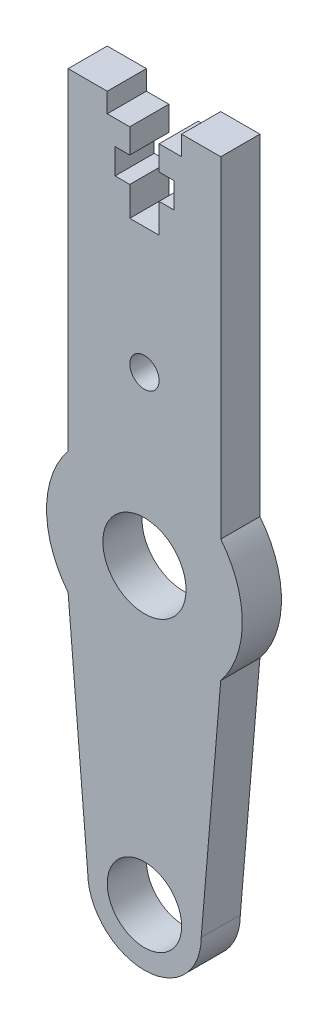
ISO-10303-21;
HEADER;
FILE_DESCRIPTION(('STEP AP214'),'2;1');
FILE_NAME('part.step','',(''),(''),'','','');
FILE_SCHEMA(('AUTOMOTIVE_DESIGN { 1 0 10303 214 1 1 1 1 }'));
ENDSEC;
DATA;
#1=APPLICATION_CONTEXT('core data for automotive mechanical design processes');
#2=APPLICATION_PROTOCOL_DEFINITION('international standard','automotive_design',2000,#1);
#3=PRODUCT_CONTEXT('',#1,'mechanical');
#4=PRODUCT('Part','Part','',(#3));
#5=PRODUCT_RELATED_PRODUCT_CATEGORY('part','',(#4));
#6=PRODUCT_DEFINITION_FORMATION('','',#4);
#7=PRODUCT_DEFINITION_CONTEXT('part definition',#1,'design');
#8=PRODUCT_DEFINITION('design','',#6,#7);
#9=PRODUCT_DEFINITION_SHAPE('','',#8);
#10=(LENGTH_UNIT() NAMED_UNIT(*) SI_UNIT(.MILLI.,.METRE.));
#11=(NAMED_UNIT(*) PLANE_ANGLE_UNIT() SI_UNIT($,.RADIAN.));
#12=(NAMED_UNIT(*) SI_UNIT($,.STERADIAN.) SOLID_ANGLE_UNIT());
#13=UNCERTAINTY_MEASURE_WITH_UNIT(LENGTH_MEASURE(1.E-05),#10,'distance_accuracy_value','');
#14=(GEOMETRIC_REPRESENTATION_CONTEXT(3) GLOBAL_UNCERTAINTY_ASSIGNED_CONTEXT((#13)) GLOBAL_UNIT_ASSIGNED_CONTEXT((#10,
#11,#12)) REPRESENTATION_CONTEXT('',''));
#15=CARTESIAN_POINT('',(0.,0.,0.));
#16=DIRECTION('',(0.,0.,1.));
#17=DIRECTION('',(1.,0.,0.));
#18=AXIS2_PLACEMENT_3D('',#15,#16,#17);
#19=CARTESIAN_POINT('',(-0.00279293334441537,-15.4899203159847,4.));
#20=DIRECTION('',(0.,0.,-1.));
#21=DIRECTION('',(-1.,0.,0.));
#22=AXIS2_PLACEMENT_3D('',#19,#20,#21);
#23=PLANE('',#22);
#24=CARTESIAN_POINT('',(-0.00279293334441537,-15.4899203159847,4.));
#25=DIRECTION('',(0.,0.,1.));
#26=DIRECTION('',(-1.,0.,0.));
#27=AXIS2_PLACEMENT_3D('',#24,#25,#26);
#28=CIRCLE('',#27,10.);
#29=CARTESIAN_POINT('',(7.79720706665559,-21.7477154548495,4.));
#30=VERTEX_POINT('',#29);
#31=CARTESIAN_POINT('',(7.79720706665559,-9.23212517711985,4.));
#32=VERTEX_POINT('',#31);
#33=EDGE_CURVE('E277',#30,#32,#28,.T.);
#34=ORIENTED_EDGE('',*,*,#33,.T.);
#35=DIRECTION('',(0.,1.,0.));
#36=VECTOR('',#35,1.);
#37=CARTESIAN_POINT('',(7.79720706665559,-9.23212517711985,4.));
#38=LINE('',#37,#36);
#39=CARTESIAN_POINT('',(7.79720706665548,24.6100796840152,4.));
#40=VERTEX_POINT('',#39);
#41=EDGE_CURVE('E145',#32,#40,#38,.T.);
#42=ORIENTED_EDGE('',*,*,#41,.T.);
#43=DIRECTION('',(-1.,0.,0.));
#44=VECTOR('',#43,1.);
#45=CARTESIAN_POINT('',(3.79720706665485,24.6100796840152,4.));
#46=LINE('',#45,#44);
#47=CARTESIAN_POINT('',(3.79720706665485,24.6100796840152,4.));
#48=VERTEX_POINT('',#47);
#49=EDGE_CURVE('E340',#40,#48,#46,.T.);
#50=ORIENTED_EDGE('',*,*,#49,.T.);
#51=DIRECTION('',(0.,-1.,0.));
#52=VECTOR('',#51,1.);
#53=CARTESIAN_POINT('',(3.79720706665485,22.6100796840152,4.));
#54=LINE('',#53,#52);
#55=CARTESIAN_POINT('',(3.79720706665485,22.6100796840152,4.));
#56=VERTEX_POINT('',#55);
#57=EDGE_CURVE('E359',#48,#56,#54,.T.);
#58=ORIENTED_EDGE('',*,*,#57,.T.);
#59=DIRECTION('',(-1.,0.,0.));
#60=VECTOR('',#59,1.);
#61=CARTESIAN_POINT('',(1.49720706665485,22.6100796840152,4.));
#62=LINE('',#61,#60);
#63=CARTESIAN_POINT('',(1.49720706665485,22.6100796840152,4.));
#64=VERTEX_POINT('',#63);
#65=EDGE_CURVE('E356',#56,#64,#62,.T.);
#66=ORIENTED_EDGE('',*,*,#65,.T.);
#67=DIRECTION('',(0.,-1.,0.));
#68=VECTOR('',#67,1.);
#69=CARTESIAN_POINT('',(1.49720706665485,20.1100796840156,4.));
#70=LINE('',#69,#68);
#71=CARTESIAN_POINT('',(1.49720706665485,20.1100796840156,4.));
#72=VERTEX_POINT('',#71);
#73=EDGE_CURVE('E358',#64,#72,#70,.T.);
#74=ORIENTED_EDGE('',*,*,#73,.T.);
#75=DIRECTION('',(1.,0.,0.));
#76=VECTOR('',#75,1.);
#77=CARTESIAN_POINT('',(1.49720706665485,20.1100796840156,4.));
#78=LINE('',#77,#76);
#79=CARTESIAN_POINT('',(2.99720706665452,20.1100796840156,4.));
#80=VERTEX_POINT('',#79);
#81=EDGE_CURVE('E361',#72,#80,#78,.T.);
#82=ORIENTED_EDGE('',*,*,#81,.T.);
#83=DIRECTION('',(0.,-1.,0.));
#84=VECTOR('',#83,1.);
#85=CARTESIAN_POINT('',(2.99720706665452,20.1100796840156,4.));
#86=LINE('',#85,#84);
#87=CARTESIAN_POINT('',(2.99720706665452,17.5100796840158,4.));
#88=VERTEX_POINT('',#87);
#89=EDGE_CURVE('E367',#80,#88,#86,.T.);
#90=ORIENTED_EDGE('',*,*,#89,.T.);
#91=DIRECTION('',(-1.,0.,0.));
#92=VECTOR('',#91,1.);
#93=CARTESIAN_POINT('',(2.99720706665452,17.5100796840158,4.));
#94=LINE('',#93,#92);
#95=CARTESIAN_POINT('',(1.49720706664139,17.5100796840158,4.));
#96=VERTEX_POINT('',#95);
#97=EDGE_CURVE('E369',#88,#96,#94,.T.);
#98=ORIENTED_EDGE('',*,*,#97,.T.);
#99=DIRECTION('',(0.,-1.,0.));
#100=VECTOR('',#99,1.);
#101=CARTESIAN_POINT('',(1.49720706664139,17.5100796840158,4.));
#102=LINE('',#101,#100);
#103=CARTESIAN_POINT('',(1.49720706664139,14.5100796840153,4.));
#104=VERTEX_POINT('',#103);
#105=EDGE_CURVE('E371',#96,#104,#102,.T.);
#106=ORIENTED_EDGE('',*,*,#105,.T.);
#107=DIRECTION('',(-1.,0.,0.));
#108=VECTOR('',#107,1.);
#109=CARTESIAN_POINT('',(-1.50279293333019,14.5100796840153,4.));
#110=LINE('',#109,#108);
#111=CARTESIAN_POINT('',(-1.50279293333019,14.5100796840153,4.));
#112=VERTEX_POINT('',#111);
#113=EDGE_CURVE('E373',#104,#112,#110,.T.);
#114=ORIENTED_EDGE('',*,*,#113,.T.);
#115=DIRECTION('',(0.,1.,0.));
#116=VECTOR('',#115,1.);
#117=CARTESIAN_POINT('',(-1.50279293333019,17.5100796840149,4.));
#118=LINE('',#117,#116);
#119=CARTESIAN_POINT('',(-1.50279293333019,17.5100796840149,4.));
#120=VERTEX_POINT('',#119);
#121=EDGE_CURVE('E375',#112,#120,#118,.T.);
#122=ORIENTED_EDGE('',*,*,#121,.T.);
#123=DIRECTION('',(-1.,0.,0.));
#124=VECTOR('',#123,1.);
#125=CARTESIAN_POINT('',(-3.00279293334441,17.5100796840149,4.));
#126=LINE('',#125,#124);
#127=CARTESIAN_POINT('',(-3.00279293334441,17.5100796840149,4.));
#128=VERTEX_POINT('',#127);
#129=EDGE_CURVE('E377',#120,#128,#126,.T.);
#130=ORIENTED_EDGE('',*,*,#129,.T.);
#131=DIRECTION('',(0.,1.,0.));
#132=VECTOR('',#131,1.);
#133=CARTESIAN_POINT('',(-3.00279293334441,20.1100796840156,4.));
#134=LINE('',#133,#132);
#135=CARTESIAN_POINT('',(-3.00279293334441,20.1100796840156,4.));
#136=VERTEX_POINT('',#135);
#137=EDGE_CURVE('E379',#128,#136,#134,.T.);
#138=ORIENTED_EDGE('',*,*,#137,.T.);
#139=DIRECTION('',(1.,0.,0.));
#140=VECTOR('',#139,1.);
#141=CARTESIAN_POINT('',(-1.50279293334452,20.1100796840156,4.));
#142=LINE('',#141,#140);
#143=CARTESIAN_POINT('',(-1.50279293334452,20.1100796840156,4.));
#144=VERTEX_POINT('',#143);
#145=EDGE_CURVE('E381',#136,#144,#142,.T.);
#146=ORIENTED_EDGE('',*,*,#145,.T.);
#147=DIRECTION('',(0.,1.,0.));
#148=VECTOR('',#147,1.);
#149=CARTESIAN_POINT('',(-1.50279293334452,20.1100796840156,4.));
#150=LINE('',#149,#148);
#151=CARTESIAN_POINT('',(-1.50279293334452,22.6100796840152,4.));
#152=VERTEX_POINT('',#151);
#153=EDGE_CURVE('E383',#144,#152,#150,.T.);
#154=ORIENTED_EDGE('',*,*,#153,.T.);
#155=DIRECTION('',(-1.,0.,0.));
#156=VECTOR('',#155,1.);
#157=CARTESIAN_POINT('',(-3.80279293334452,22.6100796840152,4.));
#158=LINE('',#157,#156);
#159=CARTESIAN_POINT('',(-3.80279293334452,22.6100796840152,4.));
#160=VERTEX_POINT('',#159);
#161=EDGE_CURVE('E385',#152,#160,#158,.T.);
#162=ORIENTED_EDGE('',*,*,#161,.T.);
#163=DIRECTION('',(0.,1.,0.));
#164=VECTOR('',#163,1.);
#165=CARTESIAN_POINT('',(-3.80279293334452,24.6100796840152,4.));
#166=LINE('',#165,#164);
#167=CARTESIAN_POINT('',(-3.80279293334452,24.6100796840152,4.));
#168=VERTEX_POINT('',#167);
#169=EDGE_CURVE('E387',#160,#168,#166,.T.);
#170=ORIENTED_EDGE('',*,*,#169,.T.);
#171=DIRECTION('',(-1.,0.,0.));
#172=VECTOR('',#171,1.);
#173=CARTESIAN_POINT('',(-3.80279293334452,24.6100796840152,4.));
#174=LINE('',#173,#172);
#175=CARTESIAN_POINT('',(-7.80279293334452,24.6100796840152,4.));
#176=VERTEX_POINT('',#175);
#177=EDGE_CURVE('E389',#168,#176,#174,.T.);
#178=ORIENTED_EDGE('',*,*,#177,.T.);
#179=DIRECTION('',(0.,-1.,0.));
#180=VECTOR('',#179,1.);
#181=CARTESIAN_POINT('',(-7.80279293334452,24.6100796840152,4.));
#182=LINE('',#181,#180);
#183=CARTESIAN_POINT('',(-7.8027929333444,-9.23212517711986,4.));
#184=VERTEX_POINT('',#183);
#185=EDGE_CURVE('E391',#176,#184,#182,.T.);
#186=ORIENTED_EDGE('',*,*,#185,.T.);
#187=CARTESIAN_POINT('',(-0.00279293334442404,-15.4899203159847,4.));
#188=DIRECTION('',(0.,0.,1.));
#189=DIRECTION('',(1.,0.,0.));
#190=AXIS2_PLACEMENT_3D('',#187,#188,#189);
#191=CIRCLE('',#190,9.99999999999998);
#192=CARTESIAN_POINT('',(-7.8027929333444,-21.7477154548495,4.));
#193=VERTEX_POINT('',#192);
#194=EDGE_CURVE('E212',#184,#193,#191,.T.);
#195=ORIENTED_EDGE('',*,*,#194,.T.);
#196=DIRECTION('',(0.083940875975852,-0.99647073682091,0.));
#197=VECTOR('',#196,1.);
#198=CARTESIAN_POINT('',(-5.8027929333444,-45.4899203159847,4.));
#199=LINE('',#198,#197);
#200=CARTESIAN_POINT('',(-5.8027929333444,-45.4899203159847,4.));
#201=VERTEX_POINT('',#200);
#202=EDGE_CURVE('E206',#193,#201,#199,.T.);
#203=ORIENTED_EDGE('',*,*,#202,.T.);
#204=CARTESIAN_POINT('',(-0.00279293334446741,-45.4899203159847,4.));
#205=DIRECTION('',(0.,0.,1.));
#206=DIRECTION('',(1.,0.,0.));
#207=AXIS2_PLACEMENT_3D('',#204,#205,#206);
#208=CIRCLE('',#207,5.8);
#209=CARTESIAN_POINT('',(5.79720706665553,-45.4899203159847,4.));
#210=VERTEX_POINT('',#209);
#211=EDGE_CURVE('E210',#201,#210,#208,.T.);
#212=ORIENTED_EDGE('',*,*,#211,.T.);
#213=DIRECTION('',(0.0839408759758517,0.99647073682091,0.));
#214=VECTOR('',#213,1.);
#215=CARTESIAN_POINT('',(5.7972070666556,-45.4899203159847,4.));
#216=LINE('',#215,#214);
#217=EDGE_CURVE('E54',#210,#30,#216,.T.);
#218=ORIENTED_EDGE('',*,*,#217,.T.);
#219=EDGE_LOOP('',(#34,#42,#50,#58,#66,#74,#82,#90,#98,#106,#114,#122,#130,#138,#146,#154,#162,
#170,#178,#186,#195,#203,#212,#218));
#220=FACE_BOUND('',#219,.T.);
#221=CARTESIAN_POINT('',(-0.00279293334440344,-15.4899203159847,4.));
#222=DIRECTION('',(0.,0.,1.));
#223=DIRECTION('',(1.,0.,0.));
#224=AXIS2_PLACEMENT_3D('',#221,#222,#223);
#225=CIRCLE('',#224,4.25);
#226=CARTESIAN_POINT('',(4.2472070666556,-15.4899203159847,4.));
#227=VERTEX_POINT('',#226);
#228=EDGE_CURVE('E234',#227,#227,#225,.T.);
#229=ORIENTED_EDGE('',*,*,#228,.F.);
#230=EDGE_LOOP('',(#229));
#231=FACE_BOUND('',#230,.T.);
#232=CARTESIAN_POINT('',(-0.00279293334446742,-45.4899203159847,4.));
#233=DIRECTION('',(0.,0.,1.));
#234=DIRECTION('',(1.,0.,0.));
#235=AXIS2_PLACEMENT_3D('',#232,#233,#234);
#236=CIRCLE('',#235,3.8);
#237=CARTESIAN_POINT('',(3.79720706665553,-45.4899203159847,4.));
#238=VERTEX_POINT('',#237);
#239=EDGE_CURVE('E445',#238,#238,#236,.T.);
#240=ORIENTED_EDGE('',*,*,#239,.F.);
#241=EDGE_LOOP('',(#240));
#242=FACE_BOUND('',#241,.T.);
#243=CARTESIAN_POINT('',(-0.00279293334440344,1.63007968401534,4.));
#244=DIRECTION('',(0.,0.,1.));
#245=DIRECTION('',(1.,0.,0.));
#246=AXIS2_PLACEMENT_3D('',#243,#244,#245);
#247=CIRCLE('',#246,1.5);
#248=CARTESIAN_POINT('',(1.4972070666556,1.63007968401534,4.));
#249=VERTEX_POINT('',#248);
#250=EDGE_CURVE('E436',#249,#249,#247,.T.);
#251=ORIENTED_EDGE('',*,*,#250,.F.);
#252=EDGE_LOOP('',(#251));
#253=FACE_BOUND('',#252,.T.);
#254=ADVANCED_FACE('F37',(#220,#231,#242,#253),#23,.F.);
#255=CARTESIAN_POINT('',(-0.00279293334441537,-15.4899203159847,0.));
#256=DIRECTION('',(0.,0.,-1.));
#257=DIRECTION('',(-1.,0.,0.));
#258=AXIS2_PLACEMENT_3D('',#255,#256,#257);
#259=PLANE('',#258);
#260=CARTESIAN_POINT('',(-0.00279293334446742,-45.4899203159847,0.));
#261=DIRECTION('',(0.,0.,1.));
#262=DIRECTION('',(1.,0.,0.));
#263=AXIS2_PLACEMENT_3D('',#260,#261,#262);
#264=CIRCLE('',#263,3.8);
#265=CARTESIAN_POINT('',(3.79720706665553,-45.4899203159847,0.));
#266=VERTEX_POINT('',#265);
#267=EDGE_CURVE('E442',#266,#266,#264,.T.);
#268=ORIENTED_EDGE('',*,*,#267,.T.);
#269=EDGE_LOOP('',(#268));
#270=FACE_BOUND('',#269,.T.);
#271=CARTESIAN_POINT('',(-0.00279293334441537,-15.4899203159847,0.));
#272=DIRECTION('',(0.,0.,1.));
#273=DIRECTION('',(-1.,0.,0.));
#274=AXIS2_PLACEMENT_3D('',#271,#272,#273);
#275=CIRCLE('',#274,10.);
#276=CARTESIAN_POINT('',(7.79720706665559,-21.7477154548495,0.));
#277=VERTEX_POINT('',#276);
#278=CARTESIAN_POINT('',(7.79720706665559,-9.23212517711985,0.));
#279=VERTEX_POINT('',#278);
#280=EDGE_CURVE('E230',#277,#279,#275,.T.);
#281=ORIENTED_EDGE('',*,*,#280,.F.);
#282=DIRECTION('',(0.0839408759758517,0.99647073682091,0.));
#283=VECTOR('',#282,1.);
#284=CARTESIAN_POINT('',(5.7972070666556,-45.4899203159847,0.));
#285=LINE('',#284,#283);
#286=CARTESIAN_POINT('',(5.79720706665553,-45.4899203159847,0.));
#287=VERTEX_POINT('',#286);
#288=EDGE_CURVE('E137',#287,#277,#285,.T.);
#289=ORIENTED_EDGE('',*,*,#288,.F.);
#290=CARTESIAN_POINT('',(-0.00279293334446741,-45.4899203159847,0.));
#291=DIRECTION('',(0.,0.,1.));
#292=DIRECTION('',(1.,0.,0.));
#293=AXIS2_PLACEMENT_3D('',#290,#291,#292);
#294=CIRCLE('',#293,5.8);
#295=CARTESIAN_POINT('',(-5.8027929333444,-45.4899203159847,0.));
#296=VERTEX_POINT('',#295);
#297=EDGE_CURVE('E131',#296,#287,#294,.T.);
#298=ORIENTED_EDGE('',*,*,#297,.F.);
#299=DIRECTION('',(0.083940875975852,-0.99647073682091,0.));
#300=VECTOR('',#299,1.);
#301=CARTESIAN_POINT('',(-5.8027929333444,-45.4899203159847,0.));
#302=LINE('',#301,#300);
#303=CARTESIAN_POINT('',(-7.8027929333444,-21.7477154548495,0.));
#304=VERTEX_POINT('',#303);
#305=EDGE_CURVE('E220',#304,#296,#302,.T.);
#306=ORIENTED_EDGE('',*,*,#305,.F.);
#307=CARTESIAN_POINT('',(-0.00279293334442404,-15.4899203159847,0.));
#308=DIRECTION('',(0.,0.,1.));
#309=DIRECTION('',(1.,0.,0.));
#310=AXIS2_PLACEMENT_3D('',#307,#308,#309);
#311=CIRCLE('',#310,9.99999999999998);
#312=CARTESIAN_POINT('',(-7.8027929333444,-9.23212517711986,0.));
#313=VERTEX_POINT('',#312);
#314=EDGE_CURVE('E272',#313,#304,#311,.T.);
#315=ORIENTED_EDGE('',*,*,#314,.F.);
#316=DIRECTION('',(0.,-1.,0.));
#317=VECTOR('',#316,1.);
#318=CARTESIAN_POINT('',(-7.80279293334452,24.6100796840152,0.));
#319=LINE('',#318,#317);
#320=CARTESIAN_POINT('',(-7.80279293334452,24.6100796840152,0.));
#321=VERTEX_POINT('',#320);
#322=EDGE_CURVE('E270',#321,#313,#319,.T.);
#323=ORIENTED_EDGE('',*,*,#322,.F.);
#324=DIRECTION('',(-1.,0.,0.));
#325=VECTOR('',#324,1.);
#326=CARTESIAN_POINT('',(-3.80279293334452,24.6100796840152,0.));
#327=LINE('',#326,#325);
#328=CARTESIAN_POINT('',(-3.80279293334452,24.6100796840152,0.));
#329=VERTEX_POINT('',#328);
#330=EDGE_CURVE('E268',#329,#321,#327,.T.);
#331=ORIENTED_EDGE('',*,*,#330,.F.);
#332=DIRECTION('',(0.,1.,0.));
#333=VECTOR('',#332,1.);
#334=CARTESIAN_POINT('',(-3.80279293334452,24.6100796840152,0.));
#335=LINE('',#334,#333);
#336=CARTESIAN_POINT('',(-3.80279293334452,22.6100796840152,0.));
#337=VERTEX_POINT('',#336);
#338=EDGE_CURVE('E266',#337,#329,#335,.T.);
#339=ORIENTED_EDGE('',*,*,#338,.F.);
#340=DIRECTION('',(-1.,0.,0.));
#341=VECTOR('',#340,1.);
#342=CARTESIAN_POINT('',(-3.80279293334452,22.6100796840152,0.));
#343=LINE('',#342,#341);
#344=CARTESIAN_POINT('',(-1.50279293334452,22.6100796840152,0.));
#345=VERTEX_POINT('',#344);
#346=EDGE_CURVE('E264',#345,#337,#343,.T.);
#347=ORIENTED_EDGE('',*,*,#346,.F.);
#348=DIRECTION('',(0.,1.,0.));
#349=VECTOR('',#348,1.);
#350=CARTESIAN_POINT('',(-1.50279293334452,20.1100796840156,0.));
#351=LINE('',#350,#349);
#352=CARTESIAN_POINT('',(-1.50279293334452,20.1100796840156,0.));
#353=VERTEX_POINT('',#352);
#354=EDGE_CURVE('E262',#353,#345,#351,.T.);
#355=ORIENTED_EDGE('',*,*,#354,.F.);
#356=DIRECTION('',(1.,0.,0.));
#357=VECTOR('',#356,1.);
#358=CARTESIAN_POINT('',(-1.50279293334452,20.1100796840156,0.));
#359=LINE('',#358,#357);
#360=CARTESIAN_POINT('',(-3.00279293334441,20.1100796840156,0.));
#361=VERTEX_POINT('',#360);
#362=EDGE_CURVE('E260',#361,#353,#359,.T.);
#363=ORIENTED_EDGE('',*,*,#362,.F.);
#364=DIRECTION('',(0.,1.,0.));
#365=VECTOR('',#364,1.);
#366=CARTESIAN_POINT('',(-3.00279293334441,20.1100796840156,0.));
#367=LINE('',#366,#365);
#368=CARTESIAN_POINT('',(-3.00279293334441,17.5100796840149,0.));
#369=VERTEX_POINT('',#368);
#370=EDGE_CURVE('E258',#369,#361,#367,.T.);
#371=ORIENTED_EDGE('',*,*,#370,.F.);
#372=DIRECTION('',(-1.,0.,0.));
#373=VECTOR('',#372,1.);
#374=CARTESIAN_POINT('',(-3.00279293334441,17.5100796840149,0.));
#375=LINE('',#374,#373);
#376=CARTESIAN_POINT('',(-1.50279293333019,17.5100796840149,0.));
#377=VERTEX_POINT('',#376);
#378=EDGE_CURVE('E256',#377,#369,#375,.T.);
#379=ORIENTED_EDGE('',*,*,#378,.F.);
#380=DIRECTION('',(0.,1.,0.));
#381=VECTOR('',#380,1.);
#382=CARTESIAN_POINT('',(-1.50279293333019,17.5100796840149,0.));
#383=LINE('',#382,#381);
#384=CARTESIAN_POINT('',(-1.50279293333019,14.5100796840153,0.));
#385=VERTEX_POINT('',#384);
#386=EDGE_CURVE('E254',#385,#377,#383,.T.);
#387=ORIENTED_EDGE('',*,*,#386,.F.);
#388=DIRECTION('',(-1.,0.,0.));
#389=VECTOR('',#388,1.);
#390=CARTESIAN_POINT('',(-1.50279293333019,14.5100796840153,0.));
#391=LINE('',#390,#389);
#392=CARTESIAN_POINT('',(1.49720706664139,14.5100796840153,0.));
#393=VERTEX_POINT('',#392);
#394=EDGE_CURVE('E252',#393,#385,#391,.T.);
#395=ORIENTED_EDGE('',*,*,#394,.F.);
#396=DIRECTION('',(0.,-1.,0.));
#397=VECTOR('',#396,1.);
#398=CARTESIAN_POINT('',(1.49720706664139,17.5100796840158,0.));
#399=LINE('',#398,#397);
#400=CARTESIAN_POINT('',(1.49720706664139,17.5100796840158,0.));
#401=VERTEX_POINT('',#400);
#402=EDGE_CURVE('E250',#401,#393,#399,.T.);
#403=ORIENTED_EDGE('',*,*,#402,.F.);
#404=DIRECTION('',(-1.,0.,0.));
#405=VECTOR('',#404,1.);
#406=CARTESIAN_POINT('',(2.99720706665452,17.5100796840158,0.));
#407=LINE('',#406,#405);
#408=CARTESIAN_POINT('',(2.99720706665452,17.5100796840158,0.));
#409=VERTEX_POINT('',#408);
#410=EDGE_CURVE('E248',#409,#401,#407,.T.);
#411=ORIENTED_EDGE('',*,*,#410,.F.);
#412=DIRECTION('',(0.,-1.,0.));
#413=VECTOR('',#412,1.);
#414=CARTESIAN_POINT('',(2.99720706665452,20.1100796840156,0.));
#415=LINE('',#414,#413);
#416=CARTESIAN_POINT('',(2.99720706665452,20.1100796840156,0.));
#417=VERTEX_POINT('',#416);
#418=EDGE_CURVE('E246',#417,#409,#415,.T.);
#419=ORIENTED_EDGE('',*,*,#418,.F.);
#420=DIRECTION('',(1.,0.,0.));
#421=VECTOR('',#420,1.);
#422=CARTESIAN_POINT('',(1.49720706665485,20.1100796840156,0.));
#423=LINE('',#422,#421);
#424=CARTESIAN_POINT('',(1.49720706665485,20.1100796840156,0.));
#425=VERTEX_POINT('',#424);
#426=EDGE_CURVE('E244',#425,#417,#423,.T.);
#427=ORIENTED_EDGE('',*,*,#426,.F.);
#428=DIRECTION('',(0.,-1.,0.));
#429=VECTOR('',#428,1.);
#430=CARTESIAN_POINT('',(1.49720706665485,20.1100796840156,0.));
#431=LINE('',#430,#429);
#432=CARTESIAN_POINT('',(1.49720706665485,22.6100796840152,0.));
#433=VERTEX_POINT('',#432);
#434=EDGE_CURVE('E242',#433,#425,#431,.T.);
#435=ORIENTED_EDGE('',*,*,#434,.F.);
#436=DIRECTION('',(-1.,0.,0.));
#437=VECTOR('',#436,1.);
#438=CARTESIAN_POINT('',(1.49720706665485,22.6100796840152,0.));
#439=LINE('',#438,#437);
#440=CARTESIAN_POINT('',(3.79720706665485,22.6100796840152,0.));
#441=VERTEX_POINT('',#440);
#442=EDGE_CURVE('E240',#441,#433,#439,.T.);
#443=ORIENTED_EDGE('',*,*,#442,.F.);
#444=DIRECTION('',(0.,-1.,0.));
#445=VECTOR('',#444,1.);
#446=CARTESIAN_POINT('',(3.79720706665485,22.6100796840152,0.));
#447=LINE('',#446,#445);
#448=CARTESIAN_POINT('',(3.79720706665485,24.6100796840152,0.));
#449=VERTEX_POINT('',#448);
#450=EDGE_CURVE('E238',#449,#441,#447,.T.);
#451=ORIENTED_EDGE('',*,*,#450,.F.);
#452=DIRECTION('',(-1.,0.,0.));
#453=VECTOR('',#452,1.);
#454=CARTESIAN_POINT('',(3.79720706665485,24.6100796840152,0.));
#455=LINE('',#454,#453);
#456=CARTESIAN_POINT('',(7.79720706665548,24.6100796840152,0.));
#457=VERTEX_POINT('',#456);
#458=EDGE_CURVE('E236',#457,#449,#455,.T.);
#459=ORIENTED_EDGE('',*,*,#458,.F.);
#460=DIRECTION('',(0.,1.,0.));
#461=VECTOR('',#460,1.);
#462=CARTESIAN_POINT('',(7.79720706665559,-9.23212517711985,0.));
#463=LINE('',#462,#461);
#464=EDGE_CURVE('E233',#279,#457,#463,.T.);
#465=ORIENTED_EDGE('',*,*,#464,.F.);
#466=EDGE_LOOP('',(#281,#289,#298,#306,#315,#323,#331,#339,#347,#355,#363,#371,#379,#387,#395,
#403,#411,#419,#427,#435,#443,#451,#459,#465));
#467=FACE_BOUND('',#466,.T.);
#468=CARTESIAN_POINT('',(-0.00279293334440344,-15.4899203159847,0.));
#469=DIRECTION('',(0.,0.,1.));
#470=DIRECTION('',(1.,0.,0.));
#471=AXIS2_PLACEMENT_3D('',#468,#469,#470);
#472=CIRCLE('',#471,4.25);
#473=CARTESIAN_POINT('',(4.2472070666556,-15.4899203159847,0.));
#474=VERTEX_POINT('',#473);
#475=EDGE_CURVE('E448',#474,#474,#472,.T.);
#476=ORIENTED_EDGE('',*,*,#475,.T.);
#477=EDGE_LOOP('',(#476));
#478=FACE_BOUND('',#477,.T.);
#479=CARTESIAN_POINT('',(-0.00279293334440344,1.63007968401534,0.));
#480=DIRECTION('',(0.,0.,1.));
#481=DIRECTION('',(1.,0.,0.));
#482=AXIS2_PLACEMENT_3D('',#479,#480,#481);
#483=CIRCLE('',#482,1.5);
#484=CARTESIAN_POINT('',(1.4972070666556,1.63007968401534,0.));
#485=VERTEX_POINT('',#484);
#486=EDGE_CURVE('E439',#485,#485,#483,.T.);
#487=ORIENTED_EDGE('',*,*,#486,.T.);
#488=EDGE_LOOP('',(#487));
#489=FACE_BOUND('',#488,.T.);
#490=ADVANCED_FACE('F344',(#270,#467,#478,#489),#259,.T.);
#491=CARTESIAN_POINT('',(-0.00279293334441537,-15.4899203159847,4.));
#492=DIRECTION('',(0.,0.,-1.));
#493=DIRECTION('',(-1.,0.,0.));
#494=AXIS2_PLACEMENT_3D('',#491,#492,#493);
#495=CYLINDRICAL_SURFACE('',#494,10.);
#496=ORIENTED_EDGE('',*,*,#280,.T.);
#497=DIRECTION('',(0.,0.,-1.));
#498=VECTOR('',#497,1.);
#499=CARTESIAN_POINT('',(7.79720706665559,-9.23212517711985,4.));
#500=LINE('',#499,#498);
#501=EDGE_CURVE('E11',#32,#279,#500,.T.);
#502=ORIENTED_EDGE('',*,*,#501,.F.);
#503=ORIENTED_EDGE('',*,*,#33,.F.);
#504=DIRECTION('',(0.,0.,-1.));
#505=VECTOR('',#504,1.);
#506=CARTESIAN_POINT('',(7.79720706665559,-21.7477154548495,4.));
#507=LINE('',#506,#505);
#508=EDGE_CURVE('E226',#30,#277,#507,.T.);
#509=ORIENTED_EDGE('',*,*,#508,.T.);
#510=EDGE_LOOP('',(#496,#502,#503,#509));
#511=FACE_BOUND('',#510,.T.);
#512=ADVANCED_FACE('F39',(#511),#495,.T.);
#513=CARTESIAN_POINT('',(7.79720706665559,-9.23212517711985,4.));
#514=DIRECTION('',(-1.,0.,0.));
#515=DIRECTION('',(0.,-1.,0.));
#516=AXIS2_PLACEMENT_3D('',#513,#514,#515);
#517=PLANE('',#516);
#518=ORIENTED_EDGE('',*,*,#464,.T.);
#519=DIRECTION('',(0.,0.,-1.));
#520=VECTOR('',#519,1.);
#521=CARTESIAN_POINT('',(7.79720706665548,24.6100796840152,4.));
#522=LINE('',#521,#520);
#523=EDGE_CURVE('E46',#40,#457,#522,.T.);
#524=ORIENTED_EDGE('',*,*,#523,.F.);
#525=ORIENTED_EDGE('',*,*,#41,.F.);
#526=ORIENTED_EDGE('',*,*,#501,.T.);
#527=EDGE_LOOP('',(#518,#524,#525,#526));
#528=FACE_BOUND('',#527,.T.);
#529=ADVANCED_FACE('F671',(#528),#517,.F.);
#530=CARTESIAN_POINT('',(3.79720706665485,24.6100796840152,4.));
#531=DIRECTION('',(0.,-1.,0.));
#532=DIRECTION('',(0.,0.,-1.));
#533=AXIS2_PLACEMENT_3D('',#530,#531,#532);
#534=PLANE('',#533);
#535=ORIENTED_EDGE('',*,*,#458,.T.);
#536=DIRECTION('',(0.,0.,-1.));
#537=VECTOR('',#536,1.);
#538=CARTESIAN_POINT('',(3.79720706665485,24.6100796840152,4.));
#539=LINE('',#538,#537);
#540=EDGE_CURVE('E332',#48,#449,#539,.T.);
#541=ORIENTED_EDGE('',*,*,#540,.F.);
#542=ORIENTED_EDGE('',*,*,#49,.F.);
#543=ORIENTED_EDGE('',*,*,#523,.T.);
#544=EDGE_LOOP('',(#535,#541,#542,#543));
#545=FACE_BOUND('',#544,.T.);
#546=ADVANCED_FACE('F338',(#545),#534,.F.);
#547=CARTESIAN_POINT('',(3.79720706665485,22.6100796840152,4.));
#548=DIRECTION('',(1.,0.,0.));
#549=DIRECTION('',(0.,0.,-1.));
#550=AXIS2_PLACEMENT_3D('',#547,#548,#549);
#551=PLANE('',#550);
#552=ORIENTED_EDGE('',*,*,#450,.T.);
#553=DIRECTION('',(0.,0.,-1.));
#554=VECTOR('',#553,1.);
#555=CARTESIAN_POINT('',(3.79720706665485,22.6100796840152,4.));
#556=LINE('',#555,#554);
#557=EDGE_CURVE('E329',#56,#441,#556,.T.);
#558=ORIENTED_EDGE('',*,*,#557,.F.);
#559=ORIENTED_EDGE('',*,*,#57,.F.);
#560=ORIENTED_EDGE('',*,*,#540,.T.);
#561=EDGE_LOOP('',(#552,#558,#559,#560));
#562=FACE_BOUND('',#561,.T.);
#563=ADVANCED_FACE('F350',(#562),#551,.F.);
#564=CARTESIAN_POINT('',(1.49720706665485,22.6100796840152,4.));
#565=DIRECTION('',(0.,-1.,0.));
#566=DIRECTION('',(0.,0.,-1.));
#567=AXIS2_PLACEMENT_3D('',#564,#565,#566);
#568=PLANE('',#567);
#569=ORIENTED_EDGE('',*,*,#442,.T.);
#570=DIRECTION('',(0.,0.,-1.));
#571=VECTOR('',#570,1.);
#572=CARTESIAN_POINT('',(1.49720706665485,22.6100796840152,4.));
#573=LINE('',#572,#571);
#574=EDGE_CURVE('E326',#64,#433,#573,.T.);
#575=ORIENTED_EDGE('',*,*,#574,.F.);
#576=ORIENTED_EDGE('',*,*,#65,.F.);
#577=ORIENTED_EDGE('',*,*,#557,.T.);
#578=EDGE_LOOP('',(#569,#575,#576,#577));
#579=FACE_BOUND('',#578,.T.);
#580=ADVANCED_FACE('F354',(#579),#568,.F.);
#581=CARTESIAN_POINT('',(1.49720706665485,20.1100796840156,4.));
#582=DIRECTION('',(1.,0.,0.));
#583=DIRECTION('',(0.,0.,-1.));
#584=AXIS2_PLACEMENT_3D('',#581,#582,#583);
#585=PLANE('',#584);
#586=ORIENTED_EDGE('',*,*,#434,.T.);
#587=DIRECTION('',(0.,0.,-1.));
#588=VECTOR('',#587,1.);
#589=CARTESIAN_POINT('',(1.49720706665485,20.1100796840156,4.));
#590=LINE('',#589,#588);
#591=EDGE_CURVE('E323',#72,#425,#590,.T.);
#592=ORIENTED_EDGE('',*,*,#591,.F.);
#593=ORIENTED_EDGE('',*,*,#73,.F.);
#594=ORIENTED_EDGE('',*,*,#574,.T.);
#595=EDGE_LOOP('',(#586,#592,#593,#594));
#596=FACE_BOUND('',#595,.T.);
#597=ADVANCED_FACE('F636',(#596),#585,.F.);
#598=CARTESIAN_POINT('',(1.49720706665485,20.1100796840156,4.));
#599=DIRECTION('',(0.,1.,0.));
#600=DIRECTION('',(0.,0.,1.));
#601=AXIS2_PLACEMENT_3D('',#598,#599,#600);
#602=PLANE('',#601);
#603=ORIENTED_EDGE('',*,*,#426,.T.);
#604=DIRECTION('',(0.,0.,-1.));
#605=VECTOR('',#604,1.);
#606=CARTESIAN_POINT('',(2.99720706665452,20.1100796840156,4.));
#607=LINE('',#606,#605);
#608=EDGE_CURVE('E320',#80,#417,#607,.T.);
#609=ORIENTED_EDGE('',*,*,#608,.F.);
#610=ORIENTED_EDGE('',*,*,#81,.F.);
#611=ORIENTED_EDGE('',*,*,#591,.T.);
#612=EDGE_LOOP('',(#603,#609,#610,#611));
#613=FACE_BOUND('',#612,.T.);
#614=ADVANCED_FACE('F626',(#613),#602,.F.);
#615=CARTESIAN_POINT('',(2.99720706665452,20.1100796840156,4.));
#616=DIRECTION('',(1.,0.,0.));
#617=DIRECTION('',(0.,0.,-1.));
#618=AXIS2_PLACEMENT_3D('',#615,#616,#617);
#619=PLANE('',#618);
#620=ORIENTED_EDGE('',*,*,#418,.T.);
#621=DIRECTION('',(0.,0.,-1.));
#622=VECTOR('',#621,1.);
#623=CARTESIAN_POINT('',(2.99720706665452,17.5100796840158,4.));
#624=LINE('',#623,#622);
#625=EDGE_CURVE('E317',#88,#409,#624,.T.);
#626=ORIENTED_EDGE('',*,*,#625,.F.);
#627=ORIENTED_EDGE('',*,*,#89,.F.);
#628=ORIENTED_EDGE('',*,*,#608,.T.);
#629=EDGE_LOOP('',(#620,#626,#627,#628));
#630=FACE_BOUND('',#629,.T.);
#631=ADVANCED_FACE('F616',(#630),#619,.F.);
#632=CARTESIAN_POINT('',(2.99720706665452,17.5100796840158,4.));
#633=DIRECTION('',(0.,-1.,0.));
#634=DIRECTION('',(0.,0.,-1.));
#635=AXIS2_PLACEMENT_3D('',#632,#633,#634);
#636=PLANE('',#635);
#637=ORIENTED_EDGE('',*,*,#410,.T.);
#638=DIRECTION('',(0.,0.,-1.));
#639=VECTOR('',#638,1.);
#640=CARTESIAN_POINT('',(1.49720706664139,17.5100796840158,4.));
#641=LINE('',#640,#639);
#642=EDGE_CURVE('E314',#96,#401,#641,.T.);
#643=ORIENTED_EDGE('',*,*,#642,.F.);
#644=ORIENTED_EDGE('',*,*,#97,.F.);
#645=ORIENTED_EDGE('',*,*,#625,.T.);
#646=EDGE_LOOP('',(#637,#643,#644,#645));
#647=FACE_BOUND('',#646,.T.);
#648=ADVANCED_FACE('F606',(#647),#636,.F.);
#649=CARTESIAN_POINT('',(1.49720706664139,17.5100796840158,4.));
#650=DIRECTION('',(1.,0.,0.));
#651=DIRECTION('',(0.,1.,0.));
#652=AXIS2_PLACEMENT_3D('',#649,#650,#651);
#653=PLANE('',#652);
#654=ORIENTED_EDGE('',*,*,#402,.T.);
#655=DIRECTION('',(0.,0.,-1.));
#656=VECTOR('',#655,1.);
#657=CARTESIAN_POINT('',(1.49720706664139,14.5100796840153,4.));
#658=LINE('',#657,#656);
#659=EDGE_CURVE('E311',#104,#393,#658,.T.);
#660=ORIENTED_EDGE('',*,*,#659,.F.);
#661=ORIENTED_EDGE('',*,*,#105,.F.);
#662=ORIENTED_EDGE('',*,*,#642,.T.);
#663=EDGE_LOOP('',(#654,#660,#661,#662));
#664=FACE_BOUND('',#663,.T.);
#665=ADVANCED_FACE('F596',(#664),#653,.F.);
#666=CARTESIAN_POINT('',(-1.50279293333019,14.5100796840153,4.));
#667=DIRECTION('',(0.,-1.,0.));
#668=DIRECTION('',(0.,0.,-1.));
#669=AXIS2_PLACEMENT_3D('',#666,#667,#668);
#670=PLANE('',#669);
#671=ORIENTED_EDGE('',*,*,#394,.T.);
#672=DIRECTION('',(0.,0.,-1.));
#673=VECTOR('',#672,1.);
#674=CARTESIAN_POINT('',(-1.50279293333019,14.5100796840153,4.));
#675=LINE('',#674,#673);
#676=EDGE_CURVE('E308',#112,#385,#675,.T.);
#677=ORIENTED_EDGE('',*,*,#676,.F.);
#678=ORIENTED_EDGE('',*,*,#113,.F.);
#679=ORIENTED_EDGE('',*,*,#659,.T.);
#680=EDGE_LOOP('',(#671,#677,#678,#679));
#681=FACE_BOUND('',#680,.T.);
#682=ADVANCED_FACE('F586',(#681),#670,.F.);
#683=CARTESIAN_POINT('',(-1.50279293333019,17.5100796840149,4.));
#684=DIRECTION('',(-1.,0.,0.));
#685=DIRECTION('',(0.,-1.,0.));
#686=AXIS2_PLACEMENT_3D('',#683,#684,#685);
#687=PLANE('',#686);
#688=ORIENTED_EDGE('',*,*,#386,.T.);
#689=DIRECTION('',(0.,0.,-1.));
#690=VECTOR('',#689,1.);
#691=CARTESIAN_POINT('',(-1.50279293333019,17.5100796840149,4.));
#692=LINE('',#691,#690);
#693=EDGE_CURVE('E305',#120,#377,#692,.T.);
#694=ORIENTED_EDGE('',*,*,#693,.F.);
#695=ORIENTED_EDGE('',*,*,#121,.F.);
#696=ORIENTED_EDGE('',*,*,#676,.T.);
#697=EDGE_LOOP('',(#688,#694,#695,#696));
#698=FACE_BOUND('',#697,.T.);
#699=ADVANCED_FACE('F576',(#698),#687,.F.);
#700=CARTESIAN_POINT('',(-3.00279293334441,17.5100796840149,4.));
#701=DIRECTION('',(0.,-1.,0.));
#702=DIRECTION('',(0.,0.,-1.));
#703=AXIS2_PLACEMENT_3D('',#700,#701,#702);
#704=PLANE('',#703);
#705=ORIENTED_EDGE('',*,*,#378,.T.);
#706=DIRECTION('',(0.,0.,-1.));
#707=VECTOR('',#706,1.);
#708=CARTESIAN_POINT('',(-3.00279293334441,17.5100796840149,4.));
#709=LINE('',#708,#707);
#710=EDGE_CURVE('E302',#128,#369,#709,.T.);
#711=ORIENTED_EDGE('',*,*,#710,.F.);
#712=ORIENTED_EDGE('',*,*,#129,.F.);
#713=ORIENTED_EDGE('',*,*,#693,.T.);
#714=EDGE_LOOP('',(#705,#711,#712,#713));
#715=FACE_BOUND('',#714,.T.);
#716=ADVANCED_FACE('F566',(#715),#704,.F.);
#717=CARTESIAN_POINT('',(-3.00279293334441,20.1100796840156,4.));
#718=DIRECTION('',(-1.,0.,0.));
#719=DIRECTION('',(0.,-1.,0.));
#720=AXIS2_PLACEMENT_3D('',#717,#718,#719);
#721=PLANE('',#720);
#722=ORIENTED_EDGE('',*,*,#370,.T.);
#723=DIRECTION('',(0.,0.,-1.));
#724=VECTOR('',#723,1.);
#725=CARTESIAN_POINT('',(-3.00279293334441,20.1100796840156,4.));
#726=LINE('',#725,#724);
#727=EDGE_CURVE('E299',#136,#361,#726,.T.);
#728=ORIENTED_EDGE('',*,*,#727,.F.);
#729=ORIENTED_EDGE('',*,*,#137,.F.);
#730=ORIENTED_EDGE('',*,*,#710,.T.);
#731=EDGE_LOOP('',(#722,#728,#729,#730));
#732=FACE_BOUND('',#731,.T.);
#733=ADVANCED_FACE('F556',(#732),#721,.F.);
#734=CARTESIAN_POINT('',(-1.50279293334452,20.1100796840156,4.));
#735=DIRECTION('',(0.,1.,0.));
#736=DIRECTION('',(0.,0.,1.));
#737=AXIS2_PLACEMENT_3D('',#734,#735,#736);
#738=PLANE('',#737);
#739=ORIENTED_EDGE('',*,*,#362,.T.);
#740=DIRECTION('',(0.,0.,-1.));
#741=VECTOR('',#740,1.);
#742=CARTESIAN_POINT('',(-1.50279293334452,20.1100796840156,4.));
#743=LINE('',#742,#741);
#744=EDGE_CURVE('E296',#144,#353,#743,.T.);
#745=ORIENTED_EDGE('',*,*,#744,.F.);
#746=ORIENTED_EDGE('',*,*,#145,.F.);
#747=ORIENTED_EDGE('',*,*,#727,.T.);
#748=EDGE_LOOP('',(#739,#745,#746,#747));
#749=FACE_BOUND('',#748,.T.);
#750=ADVANCED_FACE('F546',(#749),#738,.F.);
#751=CARTESIAN_POINT('',(-1.50279293334452,20.1100796840156,4.));
#752=DIRECTION('',(-1.,0.,0.));
#753=DIRECTION('',(0.,-1.,0.));
#754=AXIS2_PLACEMENT_3D('',#751,#752,#753);
#755=PLANE('',#754);
#756=ORIENTED_EDGE('',*,*,#354,.T.);
#757=DIRECTION('',(0.,0.,-1.));
#758=VECTOR('',#757,1.);
#759=CARTESIAN_POINT('',(-1.50279293334452,22.6100796840152,4.));
#760=LINE('',#759,#758);
#761=EDGE_CURVE('E293',#152,#345,#760,.T.);
#762=ORIENTED_EDGE('',*,*,#761,.F.);
#763=ORIENTED_EDGE('',*,*,#153,.F.);
#764=ORIENTED_EDGE('',*,*,#744,.T.);
#765=EDGE_LOOP('',(#756,#762,#763,#764));
#766=FACE_BOUND('',#765,.T.);
#767=ADVANCED_FACE('F536',(#766),#755,.F.);
#768=CARTESIAN_POINT('',(-3.80279293334452,22.6100796840152,4.));
#769=DIRECTION('',(0.,-1.,0.));
#770=DIRECTION('',(0.,0.,-1.));
#771=AXIS2_PLACEMENT_3D('',#768,#769,#770);
#772=PLANE('',#771);
#773=ORIENTED_EDGE('',*,*,#346,.T.);
#774=DIRECTION('',(0.,0.,-1.));
#775=VECTOR('',#774,1.);
#776=CARTESIAN_POINT('',(-3.80279293334452,22.6100796840152,4.));
#777=LINE('',#776,#775);
#778=EDGE_CURVE('E290',#160,#337,#777,.T.);
#779=ORIENTED_EDGE('',*,*,#778,.F.);
#780=ORIENTED_EDGE('',*,*,#161,.F.);
#781=ORIENTED_EDGE('',*,*,#761,.T.);
#782=EDGE_LOOP('',(#773,#779,#780,#781));
#783=FACE_BOUND('',#782,.T.);
#784=ADVANCED_FACE('F526',(#783),#772,.F.);
#785=CARTESIAN_POINT('',(-3.80279293334452,24.6100796840152,4.));
#786=DIRECTION('',(-1.,0.,0.));
#787=DIRECTION('',(0.,0.,1.));
#788=AXIS2_PLACEMENT_3D('',#785,#786,#787);
#789=PLANE('',#788);
#790=ORIENTED_EDGE('',*,*,#338,.T.);
#791=DIRECTION('',(0.,0.,-1.));
#792=VECTOR('',#791,1.);
#793=CARTESIAN_POINT('',(-3.80279293334452,24.6100796840152,4.));
#794=LINE('',#793,#792);
#795=EDGE_CURVE('E287',#168,#329,#794,.T.);
#796=ORIENTED_EDGE('',*,*,#795,.F.);
#797=ORIENTED_EDGE('',*,*,#169,.F.);
#798=ORIENTED_EDGE('',*,*,#778,.T.);
#799=EDGE_LOOP('',(#790,#796,#797,#798));
#800=FACE_BOUND('',#799,.T.);
#801=ADVANCED_FACE('F516',(#800),#789,.F.);
#802=CARTESIAN_POINT('',(-3.80279293334452,24.6100796840152,4.));
#803=DIRECTION('',(0.,-1.,0.));
#804=DIRECTION('',(0.,0.,-1.));
#805=AXIS2_PLACEMENT_3D('',#802,#803,#804);
#806=PLANE('',#805);
#807=ORIENTED_EDGE('',*,*,#330,.T.);
#808=DIRECTION('',(0.,0.,-1.));
#809=VECTOR('',#808,1.);
#810=CARTESIAN_POINT('',(-7.80279293334452,24.6100796840152,4.));
#811=LINE('',#810,#809);
#812=EDGE_CURVE('E284',#176,#321,#811,.T.);
#813=ORIENTED_EDGE('',*,*,#812,.F.);
#814=ORIENTED_EDGE('',*,*,#177,.F.);
#815=ORIENTED_EDGE('',*,*,#795,.T.);
#816=EDGE_LOOP('',(#807,#813,#814,#815));
#817=FACE_BOUND('',#816,.T.);
#818=ADVANCED_FACE('F507',(#817),#806,.F.);
#819=CARTESIAN_POINT('',(-7.80279293334452,24.6100796840152,4.));
#820=DIRECTION('',(1.,0.,0.));
#821=DIRECTION('',(0.,1.,0.));
#822=AXIS2_PLACEMENT_3D('',#819,#820,#821);
#823=PLANE('',#822);
#824=ORIENTED_EDGE('',*,*,#322,.T.);
#825=DIRECTION('',(0.,0.,-1.));
#826=VECTOR('',#825,1.);
#827=CARTESIAN_POINT('',(-7.8027929333444,-9.23212517711986,4.));
#828=LINE('',#827,#826);
#829=EDGE_CURVE('E281',#184,#313,#828,.T.);
#830=ORIENTED_EDGE('',*,*,#829,.F.);
#831=ORIENTED_EDGE('',*,*,#185,.F.);
#832=ORIENTED_EDGE('',*,*,#812,.T.);
#833=EDGE_LOOP('',(#824,#830,#831,#832));
#834=FACE_BOUND('',#833,.T.);
#835=ADVANCED_FACE('F397',(#834),#823,.F.);
#836=CARTESIAN_POINT('',(-0.00279293334442404,-15.4899203159847,4.));
#837=DIRECTION('',(0.,0.,-1.));
#838=DIRECTION('',(-1.,0.,0.));
#839=AXIS2_PLACEMENT_3D('',#836,#837,#838);
#840=CYLINDRICAL_SURFACE('',#839,9.99999999999998);
#841=ORIENTED_EDGE('',*,*,#314,.T.);
#842=DIRECTION('',(0.,0.,-1.));
#843=VECTOR('',#842,1.);
#844=CARTESIAN_POINT('',(-7.8027929333444,-21.7477154548495,4.));
#845=LINE('',#844,#843);
#846=EDGE_CURVE('E221',#193,#304,#845,.T.);
#847=ORIENTED_EDGE('',*,*,#846,.F.);
#848=ORIENTED_EDGE('',*,*,#194,.F.);
#849=ORIENTED_EDGE('',*,*,#829,.T.);
#850=EDGE_LOOP('',(#841,#847,#848,#849));
#851=FACE_BOUND('',#850,.T.);
#852=ADVANCED_FACE('F401',(#851),#840,.T.);
#853=CARTESIAN_POINT('',(-5.8027929333444,-45.4899203159847,4.));
#854=DIRECTION('',(0.99647073682091,0.083940875975852,0.));
#855=DIRECTION('',(-0.083940875975852,0.99647073682091,0.));
#856=AXIS2_PLACEMENT_3D('',#853,#854,#855);
#857=PLANE('',#856);
#858=ORIENTED_EDGE('',*,*,#305,.T.);
#859=DIRECTION('',(0.,0.,-1.));
#860=VECTOR('',#859,1.);
#861=CARTESIAN_POINT('',(-5.8027929333444,-45.4899203159847,4.));
#862=LINE('',#861,#860);
#863=EDGE_CURVE('E217',#201,#296,#862,.T.);
#864=ORIENTED_EDGE('',*,*,#863,.F.);
#865=ORIENTED_EDGE('',*,*,#202,.F.);
#866=ORIENTED_EDGE('',*,*,#846,.T.);
#867=EDGE_LOOP('',(#858,#864,#865,#866));
#868=FACE_BOUND('',#867,.T.);
#869=ADVANCED_FACE('F218',(#868),#857,.F.);
#870=CARTESIAN_POINT('',(-0.00279293334446741,-45.4899203159847,4.));
#871=DIRECTION('',(0.,0.,-1.));
#872=DIRECTION('',(-1.,0.,0.));
#873=AXIS2_PLACEMENT_3D('',#870,#871,#872);
#874=CYLINDRICAL_SURFACE('',#873,5.8);
#875=ORIENTED_EDGE('',*,*,#297,.T.);
#876=DIRECTION('',(0.,0.,-1.));
#877=VECTOR('',#876,1.);
#878=CARTESIAN_POINT('',(5.79720706665553,-45.4899203159847,4.));
#879=LINE('',#878,#877);
#880=EDGE_CURVE('E222',#210,#287,#879,.T.);
#881=ORIENTED_EDGE('',*,*,#880,.F.);
#882=ORIENTED_EDGE('',*,*,#211,.F.);
#883=ORIENTED_EDGE('',*,*,#863,.T.);
#884=EDGE_LOOP('',(#875,#881,#882,#883));
#885=FACE_BOUND('',#884,.T.);
#886=ADVANCED_FACE('F224',(#885),#874,.T.);
#887=CARTESIAN_POINT('',(5.7972070666556,-45.4899203159847,4.));
#888=DIRECTION('',(-0.99647073682091,0.0839408759758517,0.));
#889=DIRECTION('',(-0.0839408759758517,-0.99647073682091,0.));
#890=AXIS2_PLACEMENT_3D('',#887,#888,#889);
#891=PLANE('',#890);
#892=ORIENTED_EDGE('',*,*,#288,.T.);
#893=ORIENTED_EDGE('',*,*,#508,.F.);
#894=ORIENTED_EDGE('',*,*,#217,.F.);
#895=ORIENTED_EDGE('',*,*,#880,.T.);
#896=EDGE_LOOP('',(#892,#893,#894,#895));
#897=FACE_BOUND('',#896,.T.);
#898=ADVANCED_FACE('F405',(#897),#891,.F.);
#899=CARTESIAN_POINT('',(-0.00279293334440344,-15.4899203159847,4.));
#900=DIRECTION('',(0.,0.,-1.));
#901=DIRECTION('',(-1.,0.,0.));
#902=AXIS2_PLACEMENT_3D('',#899,#900,#901);
#903=CYLINDRICAL_SURFACE('',#902,4.25);
#904=ORIENTED_EDGE('',*,*,#228,.T.);
#905=EDGE_LOOP('',(#904));
#906=FACE_BOUND('',#905,.T.);
#907=ORIENTED_EDGE('',*,*,#475,.F.);
#908=EDGE_LOOP('',(#907));
#909=FACE_BOUND('',#908,.T.);
#910=ADVANCED_FACE('F407',(#906,#909),#903,.F.);
#911=CARTESIAN_POINT('',(-0.00279293334446742,-45.4899203159847,4.));
#912=DIRECTION('',(0.,0.,-1.));
#913=DIRECTION('',(-1.,0.,0.));
#914=AXIS2_PLACEMENT_3D('',#911,#912,#913);
#915=CYLINDRICAL_SURFACE('',#914,3.8);
#916=ORIENTED_EDGE('',*,*,#239,.T.);
#917=EDGE_LOOP('',(#916));
#918=FACE_BOUND('',#917,.T.);
#919=ORIENTED_EDGE('',*,*,#267,.F.);
#920=EDGE_LOOP('',(#919));
#921=FACE_BOUND('',#920,.T.);
#922=ADVANCED_FACE('F413',(#918,#921),#915,.F.);
#923=CARTESIAN_POINT('',(-0.00279293334440344,1.63007968401534,4.));
#924=DIRECTION('',(0.,0.,-1.));
#925=DIRECTION('',(-1.,0.,0.));
#926=AXIS2_PLACEMENT_3D('',#923,#924,#925);
#927=CYLINDRICAL_SURFACE('',#926,1.5);
#928=ORIENTED_EDGE('',*,*,#250,.T.);
#929=EDGE_LOOP('',(#928));
#930=FACE_BOUND('',#929,.T.);
#931=ORIENTED_EDGE('',*,*,#486,.F.);
#932=EDGE_LOOP('',(#931));
#933=FACE_BOUND('',#932,.T.);
#934=ADVANCED_FACE('F427',(#930,#933),#927,.F.);
#935=CLOSED_SHELL('',(#254,#490,#512,#529,#546,#563,#580,#597,#614,#631,#648,#665,#682,#699,
#716,#733,#750,#767,#784,#801,#818,#835,#852,#869,#886,#898,#910,#922,#934));
#936=MANIFOLD_SOLID_BREP('B2',#935);
#937=ADVANCED_BREP_SHAPE_REPRESENTATION('',(#18,#936),#14);
#938=SHAPE_DEFINITION_REPRESENTATION(#9,#937);
ENDSEC;
END-ISO-10303-21;
